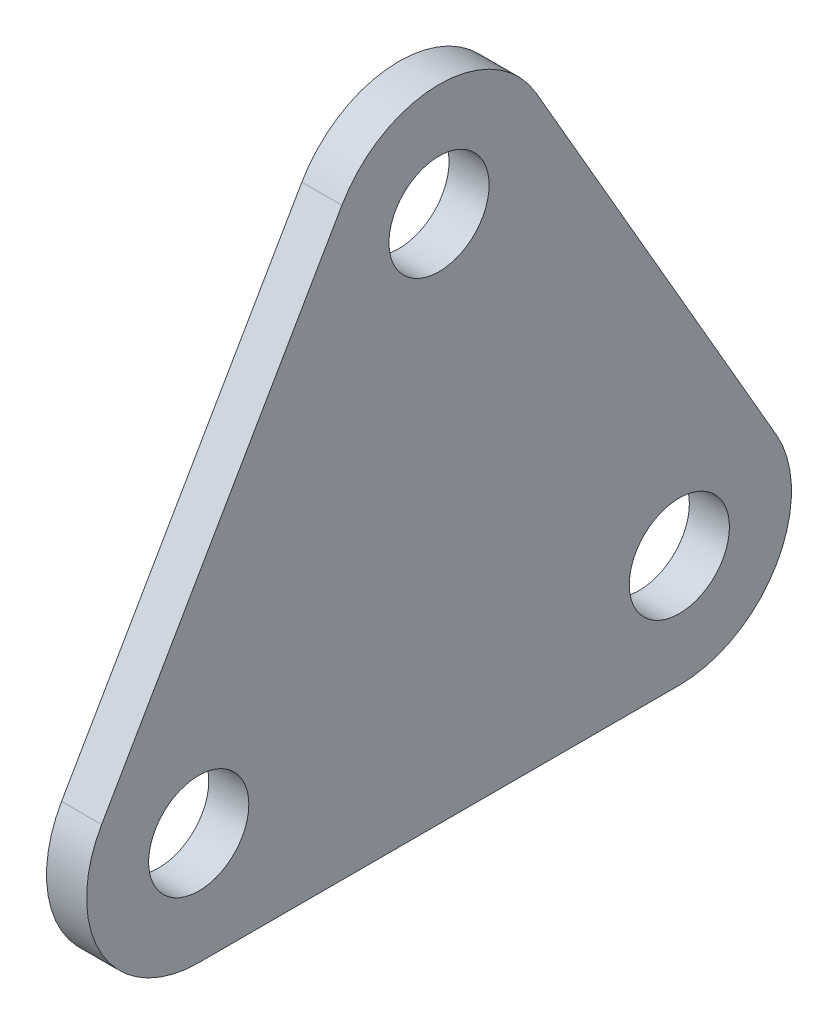
ISO-10303-21;
HEADER;
FILE_DESCRIPTION(('STEP AP214'),'2;1');
FILE_NAME('part.step','',(''),(''),'','','');
FILE_SCHEMA(('AUTOMOTIVE_DESIGN { 1 0 10303 214 1 1 1 1 }'));
ENDSEC;
DATA;
#1=APPLICATION_CONTEXT('core data for automotive mechanical design processes');
#2=APPLICATION_PROTOCOL_DEFINITION('international standard','automotive_design',2000,#1);
#3=PRODUCT_CONTEXT('',#1,'mechanical');
#4=PRODUCT('Part','Part','',(#3));
#5=PRODUCT_RELATED_PRODUCT_CATEGORY('part','',(#4));
#6=PRODUCT_DEFINITION_FORMATION('','',#4);
#7=PRODUCT_DEFINITION_CONTEXT('part definition',#1,'design');
#8=PRODUCT_DEFINITION('design','',#6,#7);
#9=PRODUCT_DEFINITION_SHAPE('','',#8);
#10=(LENGTH_UNIT() NAMED_UNIT(*) SI_UNIT(.MILLI.,.METRE.));
#11=(NAMED_UNIT(*) PLANE_ANGLE_UNIT() SI_UNIT($,.RADIAN.));
#12=(NAMED_UNIT(*) SI_UNIT($,.STERADIAN.) SOLID_ANGLE_UNIT());
#13=UNCERTAINTY_MEASURE_WITH_UNIT(LENGTH_MEASURE(1.E-05),#10,'distance_accuracy_value','');
#14=(GEOMETRIC_REPRESENTATION_CONTEXT(3) GLOBAL_UNCERTAINTY_ASSIGNED_CONTEXT((#13)) GLOBAL_UNIT_ASSIGNED_CONTEXT((#10,
#11,#12)) REPRESENTATION_CONTEXT('',''));
#15=CARTESIAN_POINT('',(0.,0.,0.));
#16=DIRECTION('',(0.,0.,1.));
#17=DIRECTION('',(1.,0.,0.));
#18=AXIS2_PLACEMENT_3D('',#15,#16,#17);
#19=CARTESIAN_POINT('',(4.,-10.7273584905661,17.5557603446572));
#20=DIRECTION('',(-1.,0.,0.));
#21=DIRECTION('',(0.,0.,1.));
#22=AXIS2_PLACEMENT_3D('',#19,#20,#21);
#23=PLANE('',#22);
#24=CARTESIAN_POINT('',(4.,-10.7273584905661,17.5557603446572));
#25=DIRECTION('',(1.,0.,0.));
#26=DIRECTION('',(0.,0.,1.));
#27=AXIS2_PLACEMENT_3D('',#24,#25,#26);
#28=CIRCLE('',#27,11.1942451951219);
#29=CARTESIAN_POINT('',(4.,-21.9216036856879,17.5557603446572));
#30=VERTEX_POINT('',#29);
#31=CARTESIAN_POINT('',(4.,-5.1302358930051,7.86125962948977));
#32=VERTEX_POINT('',#31);
#33=EDGE_CURVE('E129',#30,#32,#28,.T.);
#34=ORIENTED_EDGE('',*,*,#33,.T.);
#35=DIRECTION('',(0.,0.866025403784438,0.5));
#36=VECTOR('',#35,1.);
#37=CARTESIAN_POINT('',(4.,36.4207841786226,31.8507522529476));
#38=LINE('',#37,#36);
#39=CARTESIAN_POINT('',(4.,36.4207841786226,31.8507522529476));
#40=VERTEX_POINT('',#39);
#41=EDGE_CURVE('E87',#32,#40,#38,.T.);
#42=ORIENTED_EDGE('',*,*,#41,.T.);
#43=CARTESIAN_POINT('',(4.,30.8236615810616,41.545252968115));
#44=DIRECTION('',(1.,0.,0.));
#45=DIRECTION('',(0.,0.,-1.));
#46=AXIS2_PLACEMENT_3D('',#43,#44,#45);
#47=CIRCLE('',#46,11.1942451951219);
#48=CARTESIAN_POINT('',(4.,36.4207841786225,51.2397536832824));
#49=VERTEX_POINT('',#48);
#50=EDGE_CURVE('E100',#40,#49,#47,.T.);
#51=ORIENTED_EDGE('',*,*,#50,.T.);
#52=DIRECTION('',(0.,-0.866025403784439,0.5));
#53=VECTOR('',#52,1.);
#54=CARTESIAN_POINT('',(4.,-5.13023589300512,75.2292463067402));
#55=LINE('',#54,#53);
#56=CARTESIAN_POINT('',(4.,-5.13023589300512,75.2292463067402));
#57=VERTEX_POINT('',#56);
#58=EDGE_CURVE('E94',#49,#57,#55,.T.);
#59=ORIENTED_EDGE('',*,*,#58,.T.);
#60=CARTESIAN_POINT('',(4.,-10.7273584905661,65.5347455915727));
#61=DIRECTION('',(1.,0.,0.));
#62=DIRECTION('',(0.,0.,-1.));
#63=AXIS2_PLACEMENT_3D('',#60,#61,#62);
#64=CIRCLE('',#63,11.1942451951219);
#65=CARTESIAN_POINT('',(4.,-21.9216036856879,65.5347455915727));
#66=VERTEX_POINT('',#65);
#67=EDGE_CURVE('E98',#57,#66,#64,.T.);
#68=ORIENTED_EDGE('',*,*,#67,.T.);
#69=DIRECTION('',(0.,0.,-1.));
#70=VECTOR('',#69,1.);
#71=CARTESIAN_POINT('',(4.,-21.9216036856879,17.5557603446572));
#72=LINE('',#71,#70);
#73=EDGE_CURVE('E50',#66,#30,#72,.T.);
#74=ORIENTED_EDGE('',*,*,#73,.T.);
#75=EDGE_LOOP('',(#34,#42,#51,#59,#68,#74));
#76=FACE_BOUND('',#75,.T.);
#77=CARTESIAN_POINT('',(4.,30.8236615810616,41.545252968115));
#78=DIRECTION('',(1.,0.,0.));
#79=DIRECTION('',(0.,0.,-1.));
#80=AXIS2_PLACEMENT_3D('',#77,#78,#79);
#81=CIRCLE('',#80,5.);
#82=CARTESIAN_POINT('',(4.,30.8236615810616,36.545252968115));
#83=VERTEX_POINT('',#82);
#84=EDGE_CURVE('E122',#83,#83,#81,.T.);
#85=ORIENTED_EDGE('',*,*,#84,.F.);
#86=EDGE_LOOP('',(#85));
#87=FACE_BOUND('',#86,.T.);
#88=CARTESIAN_POINT('',(4.,-10.7273584905661,17.5557603446572));
#89=DIRECTION('',(1.,0.,0.));
#90=DIRECTION('',(0.,0.,-1.));
#91=AXIS2_PLACEMENT_3D('',#88,#89,#90);
#92=CIRCLE('',#91,4.99999999999999);
#93=CARTESIAN_POINT('',(4.,-10.7273584905661,12.5557603446572));
#94=VERTEX_POINT('',#93);
#95=EDGE_CURVE('E183',#94,#94,#92,.T.);
#96=ORIENTED_EDGE('',*,*,#95,.F.);
#97=EDGE_LOOP('',(#96));
#98=FACE_BOUND('',#97,.T.);
#99=CARTESIAN_POINT('',(4.,-10.7273584905661,65.5347455915727));
#100=DIRECTION('',(1.,0.,0.));
#101=DIRECTION('',(0.,0.,-1.));
#102=AXIS2_PLACEMENT_3D('',#99,#100,#101);
#103=CIRCLE('',#102,4.99999999999999);
#104=CARTESIAN_POINT('',(4.,-10.7273584905661,60.5347455915728));
#105=VERTEX_POINT('',#104);
#106=EDGE_CURVE('E174',#105,#105,#103,.T.);
#107=ORIENTED_EDGE('',*,*,#106,.F.);
#108=EDGE_LOOP('',(#107));
#109=FACE_BOUND('',#108,.T.);
#110=ADVANCED_FACE('F33',(#76,#87,#98,#109),#23,.F.);
#111=CARTESIAN_POINT('',(0.,-10.7273584905661,17.5557603446572));
#112=DIRECTION('',(-1.,0.,0.));
#113=DIRECTION('',(0.,0.,1.));
#114=AXIS2_PLACEMENT_3D('',#111,#112,#113);
#115=PLANE('',#114);
#116=CARTESIAN_POINT('',(0.,-10.7273584905661,17.5557603446572));
#117=DIRECTION('',(1.,0.,0.));
#118=DIRECTION('',(0.,0.,-1.));
#119=AXIS2_PLACEMENT_3D('',#116,#117,#118);
#120=CIRCLE('',#119,4.99999999999999);
#121=CARTESIAN_POINT('',(0.,-10.7273584905661,12.5557603446572));
#122=VERTEX_POINT('',#121);
#123=EDGE_CURVE('E180',#122,#122,#120,.T.);
#124=ORIENTED_EDGE('',*,*,#123,.T.);
#125=EDGE_LOOP('',(#124));
#126=FACE_BOUND('',#125,.T.);
#127=CARTESIAN_POINT('',(0.,-10.7273584905661,17.5557603446572));
#128=DIRECTION('',(1.,0.,0.));
#129=DIRECTION('',(0.,0.,1.));
#130=AXIS2_PLACEMENT_3D('',#127,#128,#129);
#131=CIRCLE('',#130,11.1942451951219);
#132=CARTESIAN_POINT('',(0.,-21.9216036856879,17.5557603446572));
#133=VERTEX_POINT('',#132);
#134=CARTESIAN_POINT('',(0.,-5.1302358930051,7.86125962948977));
#135=VERTEX_POINT('',#134);
#136=EDGE_CURVE('E118',#133,#135,#131,.T.);
#137=ORIENTED_EDGE('',*,*,#136,.F.);
#138=DIRECTION('',(0.,0.,-1.));
#139=VECTOR('',#138,1.);
#140=CARTESIAN_POINT('',(0.,-21.9216036856879,17.5557603446572));
#141=LINE('',#140,#139);
#142=CARTESIAN_POINT('',(0.,-21.9216036856879,65.5347455915727));
#143=VERTEX_POINT('',#142);
#144=EDGE_CURVE('E79',#143,#133,#141,.T.);
#145=ORIENTED_EDGE('',*,*,#144,.F.);
#146=CARTESIAN_POINT('',(0.,-10.7273584905661,65.5347455915727));
#147=DIRECTION('',(1.,0.,0.));
#148=DIRECTION('',(0.,0.,-1.));
#149=AXIS2_PLACEMENT_3D('',#146,#147,#148);
#150=CIRCLE('',#149,11.1942451951219);
#151=CARTESIAN_POINT('',(0.,-5.13023589300512,75.2292463067402));
#152=VERTEX_POINT('',#151);
#153=EDGE_CURVE('E73',#152,#143,#150,.T.);
#154=ORIENTED_EDGE('',*,*,#153,.F.);
#155=DIRECTION('',(0.,-0.866025403784439,0.5));
#156=VECTOR('',#155,1.);
#157=CARTESIAN_POINT('',(0.,-5.13023589300512,75.2292463067402));
#158=LINE('',#157,#156);
#159=CARTESIAN_POINT('',(0.,36.4207841786225,51.2397536832824));
#160=VERTEX_POINT('',#159);
#161=EDGE_CURVE('E108',#160,#152,#158,.T.);
#162=ORIENTED_EDGE('',*,*,#161,.F.);
#163=CARTESIAN_POINT('',(0.,30.8236615810616,41.545252968115));
#164=DIRECTION('',(1.,0.,0.));
#165=DIRECTION('',(0.,0.,-1.));
#166=AXIS2_PLACEMENT_3D('',#163,#164,#165);
#167=CIRCLE('',#166,11.1942451951219);
#168=CARTESIAN_POINT('',(0.,36.4207841786226,31.8507522529476));
#169=VERTEX_POINT('',#168);
#170=EDGE_CURVE('E124',#169,#160,#167,.T.);
#171=ORIENTED_EDGE('',*,*,#170,.F.);
#172=DIRECTION('',(0.,0.866025403784438,0.5));
#173=VECTOR('',#172,1.);
#174=CARTESIAN_POINT('',(0.,36.4207841786226,31.8507522529476));
#175=LINE('',#174,#173);
#176=EDGE_CURVE('E121',#135,#169,#175,.T.);
#177=ORIENTED_EDGE('',*,*,#176,.F.);
#178=EDGE_LOOP('',(#137,#145,#154,#162,#171,#177));
#179=FACE_BOUND('',#178,.T.);
#180=CARTESIAN_POINT('',(0.,30.8236615810616,41.545252968115));
#181=DIRECTION('',(1.,0.,0.));
#182=DIRECTION('',(0.,0.,-1.));
#183=AXIS2_PLACEMENT_3D('',#180,#181,#182);
#184=CIRCLE('',#183,5.);
#185=CARTESIAN_POINT('',(0.,30.8236615810616,36.545252968115));
#186=VERTEX_POINT('',#185);
#187=EDGE_CURVE('E186',#186,#186,#184,.T.);
#188=ORIENTED_EDGE('',*,*,#187,.T.);
#189=EDGE_LOOP('',(#188));
#190=FACE_BOUND('',#189,.T.);
#191=CARTESIAN_POINT('',(0.,-10.7273584905661,65.5347455915727));
#192=DIRECTION('',(1.,0.,0.));
#193=DIRECTION('',(0.,0.,-1.));
#194=AXIS2_PLACEMENT_3D('',#191,#192,#193);
#195=CIRCLE('',#194,4.99999999999999);
#196=CARTESIAN_POINT('',(0.,-10.7273584905661,60.5347455915728));
#197=VERTEX_POINT('',#196);
#198=EDGE_CURVE('E177',#197,#197,#195,.T.);
#199=ORIENTED_EDGE('',*,*,#198,.T.);
#200=EDGE_LOOP('',(#199));
#201=FACE_BOUND('',#200,.T.);
#202=ADVANCED_FACE('F138',(#126,#179,#190,#201),#115,.T.);
#203=CARTESIAN_POINT('',(4.,-10.7273584905661,17.5557603446572));
#204=DIRECTION('',(-1.,0.,0.));
#205=DIRECTION('',(0.,0.,1.));
#206=AXIS2_PLACEMENT_3D('',#203,#204,#205);
#207=CYLINDRICAL_SURFACE('',#206,11.1942451951219);
#208=ORIENTED_EDGE('',*,*,#136,.T.);
#209=DIRECTION('',(-1.,0.,0.));
#210=VECTOR('',#209,1.);
#211=CARTESIAN_POINT('',(4.,-5.1302358930051,7.86125962948977));
#212=LINE('',#211,#210);
#213=EDGE_CURVE('E11',#32,#135,#212,.T.);
#214=ORIENTED_EDGE('',*,*,#213,.F.);
#215=ORIENTED_EDGE('',*,*,#33,.F.);
#216=DIRECTION('',(-1.,0.,0.));
#217=VECTOR('',#216,1.);
#218=CARTESIAN_POINT('',(4.,-21.9216036856879,17.5557603446572));
#219=LINE('',#218,#217);
#220=EDGE_CURVE('E114',#30,#133,#219,.T.);
#221=ORIENTED_EDGE('',*,*,#220,.T.);
#222=EDGE_LOOP('',(#208,#214,#215,#221));
#223=FACE_BOUND('',#222,.T.);
#224=ADVANCED_FACE('F35',(#223),#207,.T.);
#225=CARTESIAN_POINT('',(4.,36.4207841786226,31.8507522529476));
#226=DIRECTION('',(0.,-0.5,0.866025403784438));
#227=DIRECTION('',(0.,-0.866025403784438,-0.5));
#228=AXIS2_PLACEMENT_3D('',#225,#226,#227);
#229=PLANE('',#228);
#230=ORIENTED_EDGE('',*,*,#176,.T.);
#231=DIRECTION('',(-1.,0.,0.));
#232=VECTOR('',#231,1.);
#233=CARTESIAN_POINT('',(4.,36.4207841786226,31.8507522529476));
#234=LINE('',#233,#232);
#235=EDGE_CURVE('E42',#40,#169,#234,.T.);
#236=ORIENTED_EDGE('',*,*,#235,.F.);
#237=ORIENTED_EDGE('',*,*,#41,.F.);
#238=ORIENTED_EDGE('',*,*,#213,.T.);
#239=EDGE_LOOP('',(#230,#236,#237,#238));
#240=FACE_BOUND('',#239,.T.);
#241=ADVANCED_FACE('F237',(#240),#229,.F.);
#242=CARTESIAN_POINT('',(4.,30.8236615810616,41.545252968115));
#243=DIRECTION('',(-1.,0.,0.));
#244=DIRECTION('',(0.,0.,1.));
#245=AXIS2_PLACEMENT_3D('',#242,#243,#244);
#246=CYLINDRICAL_SURFACE('',#245,11.1942451951219);
#247=ORIENTED_EDGE('',*,*,#170,.T.);
#248=DIRECTION('',(-1.,0.,0.));
#249=VECTOR('',#248,1.);
#250=CARTESIAN_POINT('',(4.,36.4207841786225,51.2397536832824));
#251=LINE('',#250,#249);
#252=EDGE_CURVE('E109',#49,#160,#251,.T.);
#253=ORIENTED_EDGE('',*,*,#252,.F.);
#254=ORIENTED_EDGE('',*,*,#50,.F.);
#255=ORIENTED_EDGE('',*,*,#235,.T.);
#256=EDGE_LOOP('',(#247,#253,#254,#255));
#257=FACE_BOUND('',#256,.T.);
#258=ADVANCED_FACE('F135',(#257),#246,.T.);
#259=CARTESIAN_POINT('',(4.,-5.13023589300512,75.2292463067402));
#260=DIRECTION('',(0.,-0.5,-0.866025403784439));
#261=DIRECTION('',(0.,0.866025403784439,-0.5));
#262=AXIS2_PLACEMENT_3D('',#259,#260,#261);
#263=PLANE('',#262);
#264=ORIENTED_EDGE('',*,*,#161,.T.);
#265=DIRECTION('',(-1.,0.,0.));
#266=VECTOR('',#265,1.);
#267=CARTESIAN_POINT('',(4.,-5.13023589300512,75.2292463067402));
#268=LINE('',#267,#266);
#269=EDGE_CURVE('E105',#57,#152,#268,.T.);
#270=ORIENTED_EDGE('',*,*,#269,.F.);
#271=ORIENTED_EDGE('',*,*,#58,.F.);
#272=ORIENTED_EDGE('',*,*,#252,.T.);
#273=EDGE_LOOP('',(#264,#270,#271,#272));
#274=FACE_BOUND('',#273,.T.);
#275=ADVANCED_FACE('F106',(#274),#263,.F.);
#276=CARTESIAN_POINT('',(4.,-10.7273584905661,65.5347455915727));
#277=DIRECTION('',(-1.,0.,0.));
#278=DIRECTION('',(0.,0.,1.));
#279=AXIS2_PLACEMENT_3D('',#276,#277,#278);
#280=CYLINDRICAL_SURFACE('',#279,11.1942451951219);
#281=ORIENTED_EDGE('',*,*,#153,.T.);
#282=DIRECTION('',(-1.,0.,0.));
#283=VECTOR('',#282,1.);
#284=CARTESIAN_POINT('',(4.,-21.9216036856879,65.5347455915727));
#285=LINE('',#284,#283);
#286=EDGE_CURVE('E110',#66,#143,#285,.T.);
#287=ORIENTED_EDGE('',*,*,#286,.F.);
#288=ORIENTED_EDGE('',*,*,#67,.F.);
#289=ORIENTED_EDGE('',*,*,#269,.T.);
#290=EDGE_LOOP('',(#281,#287,#288,#289));
#291=FACE_BOUND('',#290,.T.);
#292=ADVANCED_FACE('F112',(#291),#280,.T.);
#293=CARTESIAN_POINT('',(4.,-21.9216036856879,17.5557603446572));
#294=DIRECTION('',(0.,1.,0.));
#295=DIRECTION('',(0.,0.,1.));
#296=AXIS2_PLACEMENT_3D('',#293,#294,#295);
#297=PLANE('',#296);
#298=ORIENTED_EDGE('',*,*,#144,.T.);
#299=ORIENTED_EDGE('',*,*,#220,.F.);
#300=ORIENTED_EDGE('',*,*,#73,.F.);
#301=ORIENTED_EDGE('',*,*,#286,.T.);
#302=EDGE_LOOP('',(#298,#299,#300,#301));
#303=FACE_BOUND('',#302,.T.);
#304=ADVANCED_FACE('F143',(#303),#297,.F.);
#305=CARTESIAN_POINT('',(4.,30.8236615810616,41.545252968115));
#306=DIRECTION('',(-1.,0.,0.));
#307=DIRECTION('',(0.,0.,1.));
#308=AXIS2_PLACEMENT_3D('',#305,#306,#307);
#309=CYLINDRICAL_SURFACE('',#308,5.);
#310=ORIENTED_EDGE('',*,*,#84,.T.);
#311=EDGE_LOOP('',(#310));
#312=FACE_BOUND('',#311,.T.);
#313=ORIENTED_EDGE('',*,*,#187,.F.);
#314=EDGE_LOOP('',(#313));
#315=FACE_BOUND('',#314,.T.);
#316=ADVANCED_FACE('F145',(#312,#315),#309,.F.);
#317=CARTESIAN_POINT('',(4.,-10.7273584905661,17.5557603446572));
#318=DIRECTION('',(-1.,0.,0.));
#319=DIRECTION('',(0.,0.,1.));
#320=AXIS2_PLACEMENT_3D('',#317,#318,#319);
#321=CYLINDRICAL_SURFACE('',#320,4.99999999999999);
#322=ORIENTED_EDGE('',*,*,#95,.T.);
#323=EDGE_LOOP('',(#322));
#324=FACE_BOUND('',#323,.T.);
#325=ORIENTED_EDGE('',*,*,#123,.F.);
#326=EDGE_LOOP('',(#325));
#327=FACE_BOUND('',#326,.T.);
#328=ADVANCED_FACE('F151',(#324,#327),#321,.F.);
#329=CARTESIAN_POINT('',(4.,-10.7273584905661,65.5347455915727));
#330=DIRECTION('',(-1.,0.,0.));
#331=DIRECTION('',(0.,0.,1.));
#332=AXIS2_PLACEMENT_3D('',#329,#330,#331);
#333=CYLINDRICAL_SURFACE('',#332,4.99999999999999);
#334=ORIENTED_EDGE('',*,*,#106,.T.);
#335=EDGE_LOOP('',(#334));
#336=FACE_BOUND('',#335,.T.);
#337=ORIENTED_EDGE('',*,*,#198,.F.);
#338=EDGE_LOOP('',(#337));
#339=FACE_BOUND('',#338,.T.);
#340=ADVANCED_FACE('F165',(#336,#339),#333,.F.);
#341=CLOSED_SHELL('',(#110,#202,#224,#241,#258,#275,#292,#304,#316,#328,#340));
#342=MANIFOLD_SOLID_BREP('B2',#341);
#343=ADVANCED_BREP_SHAPE_REPRESENTATION('',(#18,#342),#14);
#344=SHAPE_DEFINITION_REPRESENTATION(#9,#343);
ENDSEC;
END-ISO-10303-21;
